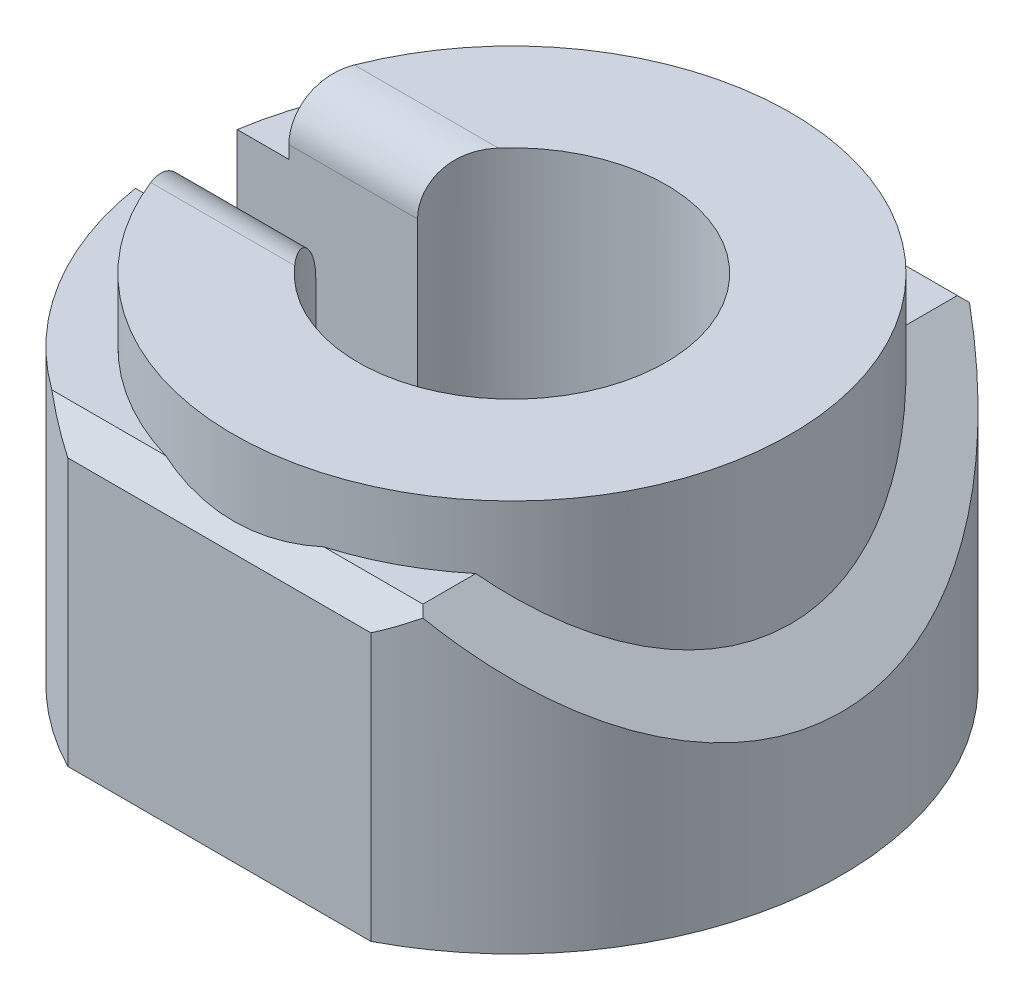
ISO-10303-21;
HEADER;
FILE_DESCRIPTION(('STEP AP214'),'2;1');
FILE_NAME('part.step','',(''),(''),'','','');
FILE_SCHEMA(('AUTOMOTIVE_DESIGN { 1 0 10303 214 1 1 1 1 }'));
ENDSEC;
DATA;
#1=APPLICATION_CONTEXT('core data for automotive mechanical design processes');
#2=APPLICATION_PROTOCOL_DEFINITION('international standard','automotive_design',2000,#1);
#3=PRODUCT_CONTEXT('',#1,'mechanical');
#4=PRODUCT('Part','Part','',(#3));
#5=PRODUCT_RELATED_PRODUCT_CATEGORY('part','',(#4));
#6=PRODUCT_DEFINITION_FORMATION('','',#4);
#7=PRODUCT_DEFINITION_CONTEXT('part definition',#1,'design');
#8=PRODUCT_DEFINITION('design','',#6,#7);
#9=PRODUCT_DEFINITION_SHAPE('','',#8);
#10=(LENGTH_UNIT() NAMED_UNIT(*) SI_UNIT(.MILLI.,.METRE.));
#11=(NAMED_UNIT(*) PLANE_ANGLE_UNIT() SI_UNIT($,.RADIAN.));
#12=(NAMED_UNIT(*) SI_UNIT($,.STERADIAN.) SOLID_ANGLE_UNIT());
#13=UNCERTAINTY_MEASURE_WITH_UNIT(LENGTH_MEASURE(1.E-05),#10,'distance_accuracy_value','');
#14=(GEOMETRIC_REPRESENTATION_CONTEXT(3) GLOBAL_UNCERTAINTY_ASSIGNED_CONTEXT((#13)) GLOBAL_UNIT_ASSIGNED_CONTEXT((#10,
#11,#12)) REPRESENTATION_CONTEXT('',''));
#15=CARTESIAN_POINT('',(0.,0.,0.));
#16=DIRECTION('',(0.,0.,1.));
#17=DIRECTION('',(1.,0.,0.));
#18=AXIS2_PLACEMENT_3D('',#15,#16,#17);
#19=CARTESIAN_POINT('',(0.,9.5,0.));
#20=DIRECTION('',(0.,1.,0.));
#21=DIRECTION('',(0.,0.,1.));
#22=AXIS2_PLACEMENT_3D('',#19,#20,#21);
#23=PLANE('',#22);
#24=DIRECTION('',(0.,0.,1.));
#25=VECTOR('',#24,1.);
#26=CARTESIAN_POINT('',(7.,9.5,0.));
#27=LINE('',#26,#25);
#28=CARTESIAN_POINT('',(7.,9.5,-10.5));
#29=VERTEX_POINT('',#28);
#30=CARTESIAN_POINT('',(7.,9.5,-8.42036222498771));
#31=VERTEX_POINT('',#30);
#32=EDGE_CURVE('E518',#29,#31,#27,.T.);
#33=ORIENTED_EDGE('',*,*,#32,.F.);
#34=DIRECTION('',(-1.,0.,0.));
#35=VECTOR('',#34,1.);
#36=CARTESIAN_POINT('',(-5.95420019817944,9.5,-10.5));
#37=LINE('',#36,#35);
#38=CARTESIAN_POINT('',(3.10684727658123,9.5,-10.5));
#39=VERTEX_POINT('',#38);
#40=EDGE_CURVE('E118',#29,#39,#37,.T.);
#41=ORIENTED_EDGE('',*,*,#40,.T.);
#42=CARTESIAN_POINT('',(0.,9.5,0.));
#43=DIRECTION('',(0.,1.,0.));
#44=DIRECTION('',(0.,0.,1.));
#45=AXIS2_PLACEMENT_3D('',#42,#43,#44);
#46=CIRCLE('',#45,10.95);
#47=EDGE_CURVE('E257',#39,#31,#46,.F.);
#48=ORIENTED_EDGE('',*,*,#47,.T.);
#49=EDGE_LOOP('',(#33,#41,#48));
#50=FACE_BOUND('',#49,.T.);
#51=ADVANCED_FACE('F103',(#50),#23,.T.);
#52=CARTESIAN_POINT('',(0.,9.5,0.));
#53=DIRECTION('',(0.,1.,0.));
#54=DIRECTION('',(0.,0.,1.));
#55=AXIS2_PLACEMENT_3D('',#52,#53,#54);
#56=CIRCLE('',#55,12.95);
#57=CARTESIAN_POINT('',(-12.7946277788766,9.5,2.));
#58=VERTEX_POINT('',#57);
#59=CARTESIAN_POINT('',(-7.57974273969772,9.5,10.5));
#60=VERTEX_POINT('',#59);
#61=EDGE_CURVE('E457',#58,#60,#56,.T.);
#62=ORIENTED_EDGE('',*,*,#61,.T.);
#63=DIRECTION('',(1.,0.,0.));
#64=VECTOR('',#63,1.);
#65=CARTESIAN_POINT('',(0.,9.5,10.5));
#66=LINE('',#65,#64);
#67=CARTESIAN_POINT('',(-3.10684727658125,9.5,10.5));
#68=VERTEX_POINT('',#67);
#69=EDGE_CURVE('E450',#60,#68,#66,.T.);
#70=ORIENTED_EDGE('',*,*,#69,.T.);
#71=CARTESIAN_POINT('',(-10.7658023388877,9.5,2.));
#72=VERTEX_POINT('',#71);
#73=EDGE_CURVE('E256',#68,#72,#46,.F.);
#74=ORIENTED_EDGE('',*,*,#73,.T.);
#75=DIRECTION('',(1.,0.,0.));
#76=VECTOR('',#75,1.);
#77=CARTESIAN_POINT('',(0.,9.5,2.));
#78=LINE('',#77,#76);
#79=EDGE_CURVE('E514',#58,#72,#78,.T.);
#80=ORIENTED_EDGE('',*,*,#79,.F.);
#81=EDGE_LOOP('',(#62,#70,#74,#80));
#82=FACE_BOUND('',#81,.T.);
#83=ADVANCED_FACE('F382',(#82),#23,.T.);
#84=CARTESIAN_POINT('',(-10.7658023388877,9.5,-2.));
#85=VERTEX_POINT('',#84);
#86=CARTESIAN_POINT('',(-3.10684727658123,9.5,-10.5));
#87=VERTEX_POINT('',#86);
#88=EDGE_CURVE('E247',#85,#87,#46,.F.);
#89=ORIENTED_EDGE('',*,*,#88,.T.);
#90=DIRECTION('',(-1.,0.,0.));
#91=VECTOR('',#90,1.);
#92=CARTESIAN_POINT('',(-5.95420019817944,9.5,-10.5));
#93=LINE('',#92,#91);
#94=CARTESIAN_POINT('',(-7.57974273969771,9.5,-10.5));
#95=VERTEX_POINT('',#94);
#96=EDGE_CURVE('E439',#87,#95,#93,.T.);
#97=ORIENTED_EDGE('',*,*,#96,.T.);
#98=CARTESIAN_POINT('',(-12.7946277788766,9.5,-2.));
#99=VERTEX_POINT('',#98);
#100=EDGE_CURVE('E250',#95,#99,#56,.T.);
#101=ORIENTED_EDGE('',*,*,#100,.T.);
#102=DIRECTION('',(1.,0.,0.));
#103=VECTOR('',#102,1.);
#104=CARTESIAN_POINT('',(0.,9.5,-2.));
#105=LINE('',#104,#103);
#106=EDGE_CURVE('E240',#99,#85,#105,.T.);
#107=ORIENTED_EDGE('',*,*,#106,.T.);
#108=EDGE_LOOP('',(#89,#97,#101,#107));
#109=FACE_BOUND('',#108,.T.);
#110=ADVANCED_FACE('F246',(#109),#23,.T.);
#111=CARTESIAN_POINT('',(8.25,8.25,-11.5));
#112=DIRECTION('',(-0.707106781186548,-0.707106781186548,0.));
#113=DIRECTION('',(0.707106781186548,-0.707106781186548,0.));
#114=AXIS2_PLACEMENT_3D('',#111,#112,#113);
#115=PLANE('',#114);
#116=CARTESIAN_POINT('',(7.,9.5,8.42036222498771));
#117=VERTEX_POINT('',#116);
#118=CARTESIAN_POINT('',(7.,9.5,10.5));
#119=VERTEX_POINT('',#118);
#120=EDGE_CURVE('E433',#117,#119,#27,.T.);
#121=ORIENTED_EDGE('',*,*,#120,.T.);
#122=DIRECTION('',(-0.577350269189624,0.577350269189624,-0.57735026918963));
#123=VECTOR('',#122,1.);
#124=CARTESIAN_POINT('',(4.66666666666668,11.8333333333333,8.16666666666664));
#125=LINE('',#124,#123);
#126=CARTESIAN_POINT('',(7.23825622687739,9.26174377312261,10.7382562268774));
#127=VERTEX_POINT('',#126);
#128=EDGE_CURVE('E460',#119,#127,#125,.F.);
#129=ORIENTED_EDGE('',*,*,#128,.T.);
#130=CARTESIAN_POINT('',(0.,16.5,0.));
#131=DIRECTION('',(-0.707106781186548,-0.707106781186548,0.));
#132=DIRECTION('',(-0.707106781186548,0.707106781186548,0.));
#133=AXIS2_PLACEMENT_3D('',#130,#131,#132);
#134=ELLIPSE('',#133,18.3140656327316,12.95);
#135=CARTESIAN_POINT('',(7.23825622687738,9.26174377312261,-10.7382562268774));
#136=VERTEX_POINT('',#135);
#137=EDGE_CURVE('E521',#127,#136,#134,.F.);
#138=ORIENTED_EDGE('',*,*,#137,.T.);
#139=DIRECTION('',(-0.577350269189628,0.577350269189628,0.577350269189622));
#140=VECTOR('',#139,1.);
#141=CARTESIAN_POINT('',(5.33333333333333,11.1666666666667,-8.83333333333333));
#142=LINE('',#141,#140);
#143=EDGE_CURVE('E458',#136,#29,#142,.T.);
#144=ORIENTED_EDGE('',*,*,#143,.T.);
#145=ORIENTED_EDGE('',*,*,#32,.T.);
#146=CARTESIAN_POINT('',(0.,16.5,0.));
#147=DIRECTION('',(-0.707106781186548,-0.707106781186548,0.));
#148=DIRECTION('',(0.707106781186548,-0.707106781186548,0.));
#149=AXIS2_PLACEMENT_3D('',#146,#147,#148);
#150=ELLIPSE('',#149,15.4856385079854,10.95);
#151=EDGE_CURVE('E276',#117,#31,#150,.F.);
#152=ORIENTED_EDGE('',*,*,#151,.F.);
#153=EDGE_LOOP('',(#121,#129,#138,#144,#145,#152));
#154=FACE_BOUND('',#153,.T.);
#155=ADVANCED_FACE('F399',(#154),#115,.F.);
#156=CARTESIAN_POINT('',(0.,-38.6281312654632,0.));
#157=DIRECTION('',(0.,1.,0.));
#158=DIRECTION('',(0.,0.,1.));
#159=AXIS2_PLACEMENT_3D('',#156,#157,#158);
#160=CYLINDRICAL_SURFACE('',#159,12.95);
#161=ORIENTED_EDGE('',*,*,#137,.F.);
#162=CARTESIAN_POINT('',(0.,19.9999999999999,0.));
#163=DIRECTION('',(0.,-0.707106781186551,-0.707106781186544));
#164=DIRECTION('',(0.,0.707106781186544,-0.707106781186551));
#165=AXIS2_PLACEMENT_3D('',#162,#163,#164);
#166=ELLIPSE('',#165,18.3140656327315,12.95);
#167=CARTESIAN_POINT('',(5.95420019817943,8.49999999999999,11.5));
#168=VERTEX_POINT('',#167);
#169=EDGE_CURVE('E467',#127,#168,#166,.T.);
#170=ORIENTED_EDGE('',*,*,#169,.T.);
#171=DIRECTION('',(0.,1.,0.));
#172=VECTOR('',#171,1.);
#173=CARTESIAN_POINT('',(5.95420019817943,-38.6281312654632,11.5));
#174=LINE('',#173,#172);
#175=CARTESIAN_POINT('',(5.95420019817943,-2.,11.5));
#176=VERTEX_POINT('',#175);
#177=EDGE_CURVE('E475',#168,#176,#174,.F.);
#178=ORIENTED_EDGE('',*,*,#177,.T.);
#179=CARTESIAN_POINT('',(0.,-2.,0.));
#180=DIRECTION('',(0.,1.,0.));
#181=DIRECTION('',(0.,0.,1.));
#182=AXIS2_PLACEMENT_3D('',#179,#180,#181);
#183=CIRCLE('',#182,12.95);
#184=CARTESIAN_POINT('',(5.95420019817944,-2.,-11.5));
#185=VERTEX_POINT('',#184);
#186=EDGE_CURVE('E471',#185,#176,#183,.F.);
#187=ORIENTED_EDGE('',*,*,#186,.F.);
#188=DIRECTION('',(0.,1.,0.));
#189=VECTOR('',#188,1.);
#190=CARTESIAN_POINT('',(5.95420019817944,-38.6281312654632,-11.5));
#191=LINE('',#190,#189);
#192=CARTESIAN_POINT('',(5.95420019817944,8.49999999999998,-11.5));
#193=VERTEX_POINT('',#192);
#194=EDGE_CURVE('E432',#193,#185,#191,.F.);
#195=ORIENTED_EDGE('',*,*,#194,.F.);
#196=CARTESIAN_POINT('',(0.,20.0000000000001,0.));
#197=DIRECTION('',(0.,0.707106781186544,-0.707106781186551));
#198=DIRECTION('',(0.,0.707106781186551,0.707106781186544));
#199=AXIS2_PLACEMENT_3D('',#196,#197,#198);
#200=ELLIPSE('',#199,18.3140656327317,12.95);
#201=EDGE_CURVE('E438',#193,#136,#200,.F.);
#202=ORIENTED_EDGE('',*,*,#201,.T.);
#203=EDGE_LOOP('',(#161,#170,#178,#187,#195,#202));
#204=FACE_BOUND('',#203,.T.);
#205=ADVANCED_FACE('F335',(#204),#160,.T.);
#206=DIRECTION('',(0.,1.,0.));
#207=VECTOR('',#206,1.);
#208=CARTESIAN_POINT('',(-5.95420019817943,-38.6281312654632,11.5));
#209=LINE('',#208,#207);
#210=CARTESIAN_POINT('',(-5.95420019817943,-2.,11.5));
#211=VERTEX_POINT('',#210);
#212=CARTESIAN_POINT('',(-5.95420019817943,8.49999999999999,11.5));
#213=VERTEX_POINT('',#212);
#214=EDGE_CURVE('E525',#211,#213,#209,.T.);
#215=ORIENTED_EDGE('',*,*,#214,.T.);
#216=CARTESIAN_POINT('',(0.,19.9999999999999,0.));
#217=DIRECTION('',(0.,-0.707106781186551,-0.707106781186544));
#218=DIRECTION('',(0.,0.707106781186544,-0.707106781186551));
#219=AXIS2_PLACEMENT_3D('',#216,#217,#218);
#220=ELLIPSE('',#219,18.3140656327315,12.95);
#221=EDGE_CURVE('E440',#213,#60,#220,.T.);
#222=ORIENTED_EDGE('',*,*,#221,.T.);
#223=ORIENTED_EDGE('',*,*,#61,.F.);
#224=DIRECTION('',(0.,1.,0.));
#225=VECTOR('',#224,1.);
#226=CARTESIAN_POINT('',(-12.7946277788766,-38.6281312654632,2.));
#227=LINE('',#226,#225);
#228=CARTESIAN_POINT('',(-12.7946277788766,2.,2.));
#229=VERTEX_POINT('',#228);
#230=EDGE_CURVE('E516',#229,#58,#227,.T.);
#231=ORIENTED_EDGE('',*,*,#230,.F.);
#232=CARTESIAN_POINT('',(-12.7946277788766,2.,2.));
#233=CARTESIAN_POINT('',(-12.7946256332506,1.94408781043635,2.00000002573826));
#234=CARTESIAN_POINT('',(-12.7949947479576,1.88820273819576,1.99765388963397));
#235=CARTESIAN_POINT('',(-12.7964529824156,1.77683916091667,1.98829682131698));
#236=CARTESIAN_POINT('',(-12.7975420354279,1.72136061867447,1.98128632149406));
#237=CARTESIAN_POINT('',(-12.8018492907163,1.55628329415424,1.95333880678219));
#238=CARTESIAN_POINT('',(-12.8061077787187,1.44780072599633,1.92548550077359));
#239=CARTESIAN_POINT('',(-12.8169175381375,1.23712269491746,1.85215577418208));
#240=CARTESIAN_POINT('',(-12.8234694310701,1.13492894511174,1.80667457605526));
#241=CARTESIAN_POINT('',(-12.8381248342533,0.939604815726317,1.69940297039855));
#242=CARTESIAN_POINT('',(-12.8462283567749,0.846474507833138,1.63761243388568));
#243=CARTESIAN_POINT('',(-12.8631491660451,0.67116909493783,1.49893143639688));
#244=CARTESIAN_POINT('',(-12.8719713191882,0.589080746372092,1.42193194358738));
#245=CARTESIAN_POINT('',(-12.8892934354307,0.438922995521076,1.25523787570596));
#246=CARTESIAN_POINT('',(-12.8977933369221,0.37085626297225,1.16554088848749));
#247=CARTESIAN_POINT('',(-12.9135655225394,0.250350104548857,0.975429449628954));
#248=CARTESIAN_POINT('',(-12.9208310146627,0.197995996840185,0.874960367828575));
#249=CARTESIAN_POINT('',(-12.9332549284202,0.110966222855452,0.666545430716961));
#250=CARTESIAN_POINT('',(-12.9384147257827,0.0762790104560916,0.558604511132324));
#251=CARTESIAN_POINT('',(-12.9447779408629,0.0340254317766947,0.375025780588701));
#252=CARTESIAN_POINT('',(-12.9467261965863,0.0212778955814986,0.300564992169304));
#253=CARTESIAN_POINT('',(-12.9493413997215,0.00426401957549387,0.150747445660465));
#254=CARTESIAN_POINT('',(-12.9500098440486,-1.22287739625539E-05,0.0753918381634177));
#255=CARTESIAN_POINT('',(-12.95,0.,0.));
#256=B_SPLINE_CURVE_WITH_KNOTS('',3,(#232,#233,#234,#235,#236,#237,#238,#239,#240,#241,#242,
#243,#244,#245,#246,#247,#248,#249,#250,#251,#252,#253,#254,#255),.UNSPECIFIED.,.F.,.F.,(4,2,2,
2,2,2,2,2,2,2,2,4),(0.,0.167632475682958,0.335249413883563,0.669766357677263,1.00437402633827,
1.33898434133517,1.67608672267633,2.01325322960552,2.35221870858211,2.69096237295107,
2.91720895132186,3.14319074117967),.UNSPECIFIED.);
#257=CARTESIAN_POINT('',(-12.95,0.,0.));
#258=VERTEX_POINT('',#257);
#259=EDGE_CURVE('E351',#229,#258,#256,.T.);
#260=ORIENTED_EDGE('',*,*,#259,.T.);
#261=CARTESIAN_POINT('',(-12.95,0.,0.));
#262=CARTESIAN_POINT('',(-12.950002014148,-1.48172827576487E-08,-0.0559162229000142));
#263=CARTESIAN_POINT('',(-12.9496373883563,0.00234644960810226,-0.111805341523206));
#264=CARTESIAN_POINT('',(-12.9481962405879,0.0117048966110774,-0.223177238487953));
#265=CARTESIAN_POINT('',(-12.9471197832777,0.0187164553872645,-0.278660053277413));
#266=CARTESIAN_POINT('',(-12.942860681548,0.0466685575209166,-0.443751704701726));
#267=CARTESIAN_POINT('',(-12.9386481279771,0.074526800289537,-0.55224462048176));
#268=CARTESIAN_POINT('',(-12.9279380237389,0.147870899920632,-0.762943912039565));
#269=CARTESIAN_POINT('',(-12.9214398346178,0.193361682499116,-0.865148521902833));
#270=CARTESIAN_POINT('',(-12.9068762993701,0.300655680759331,-1.06049052813423));
#271=CARTESIAN_POINT('',(-12.8988109492736,0.362458937763857,-1.15362790153239));
#272=CARTESIAN_POINT('',(-12.8819363508063,0.501152788024086,-1.32892507689081));
#273=CARTESIAN_POINT('',(-12.8731221313219,0.578149556362757,-1.41100036080273));
#274=CARTESIAN_POINT('',(-12.8557803600952,0.744832811767629,-1.56113298045433));
#275=CARTESIAN_POINT('',(-12.8472528645212,0.834521767473071,-1.62918758282288));
#276=CARTESIAN_POINT('',(-12.8314006752412,1.02462611917453,-1.7496809627547));
#277=CARTESIAN_POINT('',(-12.824082821451,1.12509754611792,-1.80203221684575));
#278=CARTESIAN_POINT('',(-12.8115538637689,1.33351726637838,-1.88905593253119));
#279=CARTESIAN_POINT('',(-12.8063413737306,1.44146058526554,-1.92374002991201));
#280=CARTESIAN_POINT('',(-12.7999100470753,1.62503072282316,-1.96598485794204));
#281=CARTESIAN_POINT('',(-12.7979397392583,1.69947979903887,-1.97872844716275));
#282=CARTESIAN_POINT('',(-12.7952941861159,1.84927457081914,-1.99573722333451));
#283=CARTESIAN_POINT('',(-12.7946174381016,1.92461912358411,-2.0000122481689));
#284=CARTESIAN_POINT('',(-12.7946277788766,2.,-2.));
#285=B_SPLINE_CURVE_WITH_KNOTS('',3,(#261,#262,#263,#264,#265,#266,#267,#268,#269,#270,#271,
#272,#273,#274,#275,#276,#277,#278,#279,#280,#281,#282,#283,#284),.UNSPECIFIED.,.F.,.F.,(4,2,2,
2,2,2,2,2,2,2,2,4),(0.,0.167644611880985,0.335273996133688,0.669819430009937,1.00445838783946,
1.33909819338527,1.67616509087818,2.01329763845469,2.35227571580648,2.69103024881158,
2.91724192675227,3.14319066139638),.UNSPECIFIED.);
#286=CARTESIAN_POINT('',(-12.7946277788766,2.,-2.));
#287=VERTEX_POINT('',#286);
#288=EDGE_CURVE('E352',#258,#287,#285,.T.);
#289=ORIENTED_EDGE('',*,*,#288,.T.);
#290=DIRECTION('',(0.,1.,0.));
#291=VECTOR('',#290,1.);
#292=CARTESIAN_POINT('',(-12.7946277788766,-38.6281312654632,-2.));
#293=LINE('',#292,#291);
#294=EDGE_CURVE('E252',#287,#99,#293,.T.);
#295=ORIENTED_EDGE('',*,*,#294,.T.);
#296=ORIENTED_EDGE('',*,*,#100,.F.);
#297=CARTESIAN_POINT('',(0.,20.0000000000001,0.));
#298=DIRECTION('',(0.,0.707106781186544,-0.707106781186551));
#299=DIRECTION('',(0.,0.707106781186551,0.707106781186544));
#300=AXIS2_PLACEMENT_3D('',#297,#298,#299);
#301=ELLIPSE('',#300,18.3140656327317,12.95);
#302=CARTESIAN_POINT('',(-5.95420019817944,8.49999999999998,-11.5));
#303=VERTEX_POINT('',#302);
#304=EDGE_CURVE('E436',#95,#303,#301,.F.);
#305=ORIENTED_EDGE('',*,*,#304,.T.);
#306=DIRECTION('',(0.,1.,0.));
#307=VECTOR('',#306,1.);
#308=CARTESIAN_POINT('',(-5.95420019817944,-38.6281312654632,-11.5));
#309=LINE('',#308,#307);
#310=CARTESIAN_POINT('',(-5.95420019817944,-2.,-11.5));
#311=VERTEX_POINT('',#310);
#312=EDGE_CURVE('E427',#311,#303,#309,.T.);
#313=ORIENTED_EDGE('',*,*,#312,.F.);
#314=EDGE_CURVE('E473',#211,#311,#183,.F.);
#315=ORIENTED_EDGE('',*,*,#314,.F.);
#316=EDGE_LOOP('',(#215,#222,#223,#231,#260,#289,#295,#296,#305,#313,#315));
#317=FACE_BOUND('',#316,.T.);
#318=ADVANCED_FACE('F391',(#317),#160,.T.);
#319=CARTESIAN_POINT('',(3.10684727658125,9.5,10.5));
#320=VERTEX_POINT('',#319);
#321=EDGE_CURVE('E259',#117,#320,#46,.F.);
#322=ORIENTED_EDGE('',*,*,#321,.T.);
#323=DIRECTION('',(1.,0.,0.));
#324=VECTOR('',#323,1.);
#325=CARTESIAN_POINT('',(0.,9.5,10.5));
#326=LINE('',#325,#324);
#327=EDGE_CURVE('E452',#320,#119,#326,.T.);
#328=ORIENTED_EDGE('',*,*,#327,.T.);
#329=ORIENTED_EDGE('',*,*,#120,.F.);
#330=EDGE_LOOP('',(#322,#328,#329));
#331=FACE_BOUND('',#330,.T.);
#332=ADVANCED_FACE('F383',(#331),#23,.T.);
#333=CARTESIAN_POINT('',(0.,-2.,0.));
#334=DIRECTION('',(0.,1.,0.));
#335=DIRECTION('',(0.,0.,1.));
#336=AXIS2_PLACEMENT_3D('',#333,#334,#335);
#337=PLANE('',#336);
#338=CARTESIAN_POINT('',(0.,-2.,0.));
#339=DIRECTION('',(0.,1.,0.));
#340=DIRECTION('',(0.,0.,1.));
#341=AXIS2_PLACEMENT_3D('',#338,#339,#340);
#342=CIRCLE('',#341,1.6);
#343=CARTESIAN_POINT('',(0.,-2.,1.6));
#344=VERTEX_POINT('',#343);
#345=EDGE_CURVE('E502',#344,#344,#342,.T.);
#346=ORIENTED_EDGE('',*,*,#345,.T.);
#347=EDGE_LOOP('',(#346));
#348=FACE_BOUND('',#347,.T.);
#349=DIRECTION('',(1.,0.,0.));
#350=VECTOR('',#349,1.);
#351=CARTESIAN_POINT('',(0.,-2.,11.5));
#352=LINE('',#351,#350);
#353=EDGE_CURVE('E270',#211,#176,#352,.T.);
#354=ORIENTED_EDGE('',*,*,#353,.F.);
#355=ORIENTED_EDGE('',*,*,#314,.T.);
#356=DIRECTION('',(1.,0.,0.));
#357=VECTOR('',#356,1.);
#358=CARTESIAN_POINT('',(0.,-2.,-11.5));
#359=LINE('',#358,#357);
#360=EDGE_CURVE('E264',#311,#185,#359,.T.);
#361=ORIENTED_EDGE('',*,*,#360,.T.);
#362=ORIENTED_EDGE('',*,*,#186,.T.);
#363=EDGE_LOOP('',(#354,#355,#361,#362));
#364=FACE_BOUND('',#363,.T.);
#365=ADVANCED_FACE('F390',(#348,#364),#337,.F.);
#366=CARTESIAN_POINT('',(0.,-2.,0.));
#367=DIRECTION('',(0.,1.,0.));
#368=DIRECTION('',(0.,0.,1.));
#369=AXIS2_PLACEMENT_3D('',#366,#367,#368);
#370=CYLINDRICAL_SURFACE('',#369,10.95);
#371=CARTESIAN_POINT('',(0.,12.,0.));
#372=DIRECTION('',(0.,1.,0.));
#373=DIRECTION('',(0.,0.,1.));
#374=AXIS2_PLACEMENT_3D('',#371,#372,#373);
#375=CIRCLE('',#374,10.95);
#376=CARTESIAN_POINT('',(-10.1932575754761,12.,4.));
#377=VERTEX_POINT('',#376);
#378=CARTESIAN_POINT('',(-10.1932575754761,12.,-4.));
#379=VERTEX_POINT('',#378);
#380=EDGE_CURVE('E481',#377,#379,#375,.T.);
#381=ORIENTED_EDGE('',*,*,#380,.F.);
#382=CARTESIAN_POINT('',(-10.1932575754761,12.,4.));
#383=CARTESIAN_POINT('',(-10.215252763081,11.9999980404342,3.94395580736491));
#384=CARTESIAN_POINT('',(-10.2367726894939,11.9976424240735,3.88774865686013));
#385=CARTESIAN_POINT('',(-10.278763936511,11.9881427232847,3.77532885443158));
#386=CARTESIAN_POINT('',(-10.2992349308407,11.9809971585409,3.7191162061801));
#387=CARTESIAN_POINT('',(-10.3589318186561,11.9522440665045,3.55093412099844));
#388=CARTESIAN_POINT('',(-10.396414218504,11.9233199415595,3.43949052860539));
#389=CARTESIAN_POINT('',(-10.4660062849451,11.8459210445999,3.22154624898223));
#390=CARTESIAN_POINT('',(-10.4981034747342,11.7974017349488,3.11505744249417));
#391=CARTESIAN_POINT('',(-10.5564731190204,11.6816816580941,2.91111916175955));
#392=CARTESIAN_POINT('',(-10.5827523464388,11.6145028208865,2.81365925433323));
#393=CARTESIAN_POINT('',(-10.6284541461997,11.4667138672042,2.6356283805551));
#394=CARTESIAN_POINT('',(-10.648139927659,11.386878914054,2.55448069235084));
#395=CARTESIAN_POINT('',(-10.6825646937403,11.2139256856405,2.40647086598696));
#396=CARTESIAN_POINT('',(-10.6973022679429,11.1208036338297,2.33961280286125));
#397=CARTESIAN_POINT('',(-10.721848488476,10.9270807844682,2.22437484910673));
#398=CARTESIAN_POINT('',(-10.7317936886813,10.8267944908461,2.17549381476017));
#399=CARTESIAN_POINT('',(-10.7477910021851,10.6192576023916,2.09503794195539));
#400=CARTESIAN_POINT('',(-10.7538463120501,10.5120128058043,2.06344889675159));
#401=CARTESIAN_POINT('',(-10.7606900674744,10.3366406188279,2.02737163758506));
#402=CARTESIAN_POINT('',(-10.7626129789312,10.269688414526,2.01711247846942));
#403=CARTESIAN_POINT('',(-10.7651655394167,10.1351674568692,2.00342879892052));
#404=CARTESIAN_POINT('',(-10.7657971441038,10.0675997917526,1.99999394343758));
#405=CARTESIAN_POINT('',(-10.7658023388877,10.,2.));
#406=B_SPLINE_CURVE_WITH_KNOTS('',3,(#382,#383,#384,#385,#386,#387,#388,#389,#390,#391,#392,
#393,#394,#395,#396,#397,#398,#399,#400,#401,#402,#403,#404,#405),.UNSPECIFIED.,.F.,.F.,(4,2,2,
2,2,2,2,2,2,2,2,4),(0.,0.180521425972547,0.36109866715912,0.722475887843784,1.08467914258227,
1.44645849863325,1.79131682507501,2.1362733654185,2.47071461982338,2.80488069013857,
3.00783442325068,3.21048055858087),.UNSPECIFIED.);
#407=CARTESIAN_POINT('',(-10.7658023388877,10.,2.));
#408=VERTEX_POINT('',#407);
#409=EDGE_CURVE('E293',#377,#408,#406,.T.);
#410=ORIENTED_EDGE('',*,*,#409,.T.);
#411=DIRECTION('',(0.,1.,0.));
#412=VECTOR('',#411,1.);
#413=CARTESIAN_POINT('',(-10.7658023388877,-2.,2.));
#414=LINE('',#413,#412);
#415=EDGE_CURVE('E511',#72,#408,#414,.T.);
#416=ORIENTED_EDGE('',*,*,#415,.F.);
#417=ORIENTED_EDGE('',*,*,#73,.F.);
#418=CARTESIAN_POINT('',(0.,19.9999999999999,0.));
#419=DIRECTION('',(0.,-0.707106781186551,-0.707106781186544));
#420=DIRECTION('',(0.,0.707106781186544,-0.707106781186551));
#421=AXIS2_PLACEMENT_3D('',#418,#419,#420);
#422=ELLIPSE('',#421,15.4856385079853,10.95);
#423=EDGE_CURVE('E111',#68,#320,#422,.F.);
#424=ORIENTED_EDGE('',*,*,#423,.T.);
#425=ORIENTED_EDGE('',*,*,#321,.F.);
#426=ORIENTED_EDGE('',*,*,#151,.T.);
#427=ORIENTED_EDGE('',*,*,#47,.F.);
#428=CARTESIAN_POINT('',(0.,20.0000000000001,0.));
#429=DIRECTION('',(0.,0.707106781186544,-0.707106781186551));
#430=DIRECTION('',(0.,0.707106781186551,0.707106781186544));
#431=AXIS2_PLACEMENT_3D('',#428,#429,#430);
#432=ELLIPSE('',#431,15.4856385079855,10.95);
#433=EDGE_CURVE('E12',#39,#87,#432,.T.);
#434=ORIENTED_EDGE('',*,*,#433,.T.);
#435=ORIENTED_EDGE('',*,*,#88,.F.);
#436=DIRECTION('',(0.,1.,0.));
#437=VECTOR('',#436,1.);
#438=CARTESIAN_POINT('',(-10.7658023388877,-2.,-2.));
#439=LINE('',#438,#437);
#440=CARTESIAN_POINT('',(-10.7658023388877,10.,-2.));
#441=VERTEX_POINT('',#440);
#442=EDGE_CURVE('E235',#85,#441,#439,.T.);
#443=ORIENTED_EDGE('',*,*,#442,.T.);
#444=CARTESIAN_POINT('',(-10.7658023388877,10.,-2.));
#445=CARTESIAN_POINT('',(-10.7657998873099,10.0553582028588,-1.99999993684639));
#446=CARTESIAN_POINT('',(-10.7653753538818,10.1106898730469,-2.00229990746368));
#447=CARTESIAN_POINT('',(-10.7636662232265,10.2209566549138,-2.01147247984258));
#448=CARTESIAN_POINT('',(-10.7623816690621,10.2758917863087,-2.01834485265639));
#449=CARTESIAN_POINT('',(-10.757220221801,10.4394004844256,-2.04574708555658));
#450=CARTESIAN_POINT('',(-10.7520356433773,10.5468776363525,-2.0730622841861));
#451=CARTESIAN_POINT('',(-10.7379249867092,10.7556341988424,-2.14494578853034));
#452=CARTESIAN_POINT('',(-10.7289971088818,10.8569106015351,-2.18952239183904));
#453=CARTESIAN_POINT('',(-10.7070375952912,11.0504094007113,-2.29449546774585));
#454=CARTESIAN_POINT('',(-10.6940065910536,11.1426331876494,-2.3548895055899));
#455=CARTESIAN_POINT('',(-10.663441302374,11.3156132570701,-2.48963518133261));
#456=CARTESIAN_POINT('',(-10.6459003049603,11.3963521640152,-2.56400758077179));
#457=CARTESIAN_POINT('',(-10.6060347247716,11.5440971934401,-2.72421116398895));
#458=CARTESIAN_POINT('',(-10.583710153558,11.6111033491097,-2.81004232007207));
#459=CARTESIAN_POINT('',(-10.5338703812319,11.7305650593691,-2.99149138482339));
#460=CARTESIAN_POINT('',(-10.5062953235317,11.7828336329972,-3.08721567446595));
#461=CARTESIAN_POINT('',(-10.4462675291435,11.8707994852415,-3.28460588133174));
#462=CARTESIAN_POINT('',(-10.4138128839891,11.9064902576427,-3.38627411375307));
#463=CARTESIAN_POINT('',(-10.3508352796189,11.9559582584554,-3.57359590414467));
#464=CARTESIAN_POINT('',(-10.3210475147448,11.972552033782,-3.65877150228198));
#465=CARTESIAN_POINT('',(-10.2589563222909,11.9945730418643,-3.82944868317047));
#466=CARTESIAN_POINT('',(-10.2266582993269,12.0000236106701,-3.91494920822444));
#467=CARTESIAN_POINT('',(-10.1932575754761,12.,-4.));
#468=B_SPLINE_CURVE_WITH_KNOTS('',3,(#444,#445,#446,#447,#448,#449,#450,#451,#452,#453,#454,
#455,#456,#457,#458,#459,#460,#461,#462,#463,#464,#465,#466,#467),.UNSPECIFIED.,.F.,.F.,(4,2,2,
2,2,2,2,2,2,2,2,4),(0.,0.165972516705542,0.331936723516194,0.663271950051158,0.994766648251569,
1.32621034992755,1.65815027952558,1.99008940686704,2.3260677397977,2.66217782144776,
2.93671832017174,3.21068328609285),.UNSPECIFIED.);
#469=EDGE_CURVE('E286',#441,#379,#468,.T.);
#470=ORIENTED_EDGE('',*,*,#469,.T.);
#471=EDGE_LOOP('',(#381,#410,#416,#417,#424,#425,#426,#427,#434,#435,#443,#470));
#472=FACE_BOUND('',#471,.T.);
#473=ADVANCED_FACE('F255',(#472),#370,.T.);
#474=CARTESIAN_POINT('',(0.,12.,0.));
#475=DIRECTION('',(0.,1.,0.));
#476=DIRECTION('',(0.,0.,1.));
#477=AXIS2_PLACEMENT_3D('',#474,#475,#476);
#478=PLANE('',#477);
#479=CARTESIAN_POINT('',(0.,12.,0.));
#480=DIRECTION('',(0.,1.,0.));
#481=DIRECTION('',(0.,0.,1.));
#482=AXIS2_PLACEMENT_3D('',#479,#480,#481);
#483=CIRCLE('',#482,6.05);
#484=CARTESIAN_POINT('',(-4.53899768671454,12.,4.));
#485=VERTEX_POINT('',#484);
#486=CARTESIAN_POINT('',(-4.53899768671455,12.,-4.));
#487=VERTEX_POINT('',#486);
#488=EDGE_CURVE('E478',#485,#487,#483,.T.);
#489=ORIENTED_EDGE('',*,*,#488,.F.);
#490=DIRECTION('',(-1.,0.,0.));
#491=VECTOR('',#490,1.);
#492=CARTESIAN_POINT('',(-10.7658023388877,12.,4.));
#493=LINE('',#492,#491);
#494=EDGE_CURVE('E283',#485,#377,#493,.T.);
#495=ORIENTED_EDGE('',*,*,#494,.T.);
#496=ORIENTED_EDGE('',*,*,#380,.T.);
#497=DIRECTION('',(-1.,0.,0.));
#498=VECTOR('',#497,1.);
#499=CARTESIAN_POINT('',(0.,12.,-4.));
#500=LINE('',#499,#498);
#501=EDGE_CURVE('E281',#379,#487,#500,.F.);
#502=ORIENTED_EDGE('',*,*,#501,.T.);
#503=EDGE_LOOP('',(#489,#495,#496,#502));
#504=FACE_BOUND('',#503,.T.);
#505=ADVANCED_FACE('F333',(#504),#478,.T.);
#506=CARTESIAN_POINT('',(0.,12.,0.));
#507=DIRECTION('',(0.,-1.,0.));
#508=DIRECTION('',(0.,0.,-1.));
#509=AXIS2_PLACEMENT_3D('',#506,#507,#508);
#510=CYLINDRICAL_SURFACE('',#509,6.05);
#511=DIRECTION('',(0.,-1.,0.));
#512=VECTOR('',#511,1.);
#513=CARTESIAN_POINT('',(-5.70985989320228,12.,2.));
#514=LINE('',#513,#512);
#515=CARTESIAN_POINT('',(-5.70985989320228,10.,2.));
#516=VERTEX_POINT('',#515);
#517=CARTESIAN_POINT('',(-5.70985989320228,2.,2.));
#518=VERTEX_POINT('',#517);
#519=EDGE_CURVE('E509',#516,#518,#514,.T.);
#520=ORIENTED_EDGE('',*,*,#519,.F.);
#521=CARTESIAN_POINT('',(-5.70985989320228,10.,2.));
#522=CARTESIAN_POINT('',(-5.70985665184003,10.0532053042563,1.99999336319484));
#523=CARTESIAN_POINT('',(-5.70911610995553,10.106408198698,2.00212303069396));
#524=CARTESIAN_POINT('',(-5.70613760373049,10.2124313776622,2.01060455256753));
#525=CARTESIAN_POINT('',(-5.7038997204515,10.2652516827405,2.01695617837775));
#526=CARTESIAN_POINT('',(-5.69790683103353,10.3700832199718,2.03382243456253));
#527=CARTESIAN_POINT('',(-5.69415340435184,10.422095236076,2.04433273065822));
#528=CARTESIAN_POINT('',(-5.68508985943883,10.5249797618576,2.0694031316168));
#529=CARTESIAN_POINT('',(-5.6797797620688,10.5758522867959,2.0839631822079));
#530=CARTESIAN_POINT('',(-5.66142560404254,10.7262712050896,2.13354689532509));
#531=CARTESIAN_POINT('',(-5.64595546194936,10.8236597079092,2.17448076487204));
#532=CARTESIAN_POINT('',(-5.60806890333301,11.0096716006424,2.27039669087423));
#533=CARTESIAN_POINT('',(-5.58565434606532,11.09829732828,2.32537498646975));
#534=CARTESIAN_POINT('',(-5.53329263570168,11.2649151662318,2.44736196058285));
#535=CARTESIAN_POINT('',(-5.50331588685253,11.3428635954746,2.51441760355374));
#536=CARTESIAN_POINT('',(-5.43561959081167,11.4860008954284,2.65759270433749));
#537=CARTESIAN_POINT('',(-5.39789887109547,11.551187830982,2.73371353398806));
#538=CARTESIAN_POINT('',(-5.31333235029421,11.6699608052301,2.8947440315096));
#539=CARTESIAN_POINT('',(-5.26621221211059,11.7230580441056,2.97986868169871));
#540=CARTESIAN_POINT('',(-5.16423745906089,11.814586533647,3.15329686891499));
#541=CARTESIAN_POINT('',(-5.10937859729739,11.8530096881788,3.24160213146669));
#542=CARTESIAN_POINT('',(-4.98660868172301,11.9192117565667,3.42781787679961));
#543=CARTESIAN_POINT('',(-4.91793216678617,11.9454518422045,3.52576450288015));
#544=CARTESIAN_POINT('',(-4.77342353859703,11.9826169982765,3.71906983601741));
#545=CARTESIAN_POINT('',(-4.69759553673488,11.9935508116895,3.81442998992018));
#546=CARTESIAN_POINT('',(-4.5925521730883,11.9993001488052,3.93861037214574));
#547=CARTESIAN_POINT('',(-4.56592474728217,12.0000006374235,3.96945085853243));
#548=CARTESIAN_POINT('',(-4.53899768671454,12.,4.));
#549=B_SPLINE_CURVE_WITH_KNOTS('',3,(#521,#522,#523,#524,#525,#526,#527,#528,#529,#530,#531,
#532,#533,#534,#535,#536,#537,#538,#539,#540,#541,#542,#543,#544,#545,#546,#547,#548),
.UNSPECIFIED.,.F.,.F.,(4,2,2,2,2,2,2,2,2,2,2,2,2,4),(0.,0.159563818875073,0.319119000144218,
0.478508324860532,0.637895513663203,0.956547369648708,1.27511398534209,1.59494724331591,
1.91482896341394,2.24596417783348,2.57728182648455,2.94334475203772,3.30919849615182,
3.43140717377676),.UNSPECIFIED.);
#550=EDGE_CURVE('E321',#516,#485,#549,.T.);
#551=ORIENTED_EDGE('',*,*,#550,.T.);
#552=ORIENTED_EDGE('',*,*,#488,.T.);
#553=CARTESIAN_POINT('',(-4.53899768671455,12.,-4.));
#554=CARTESIAN_POINT('',(-4.5952123473944,12.0000018733828,-3.93624044359645));
#555=CARTESIAN_POINT('',(-4.65009154089937,11.9969487981662,-3.87122741054082));
#556=CARTESIAN_POINT('',(-4.7568872906507,11.9840360777183,-3.73920943612675));
#557=CARTESIAN_POINT('',(-4.80879614295638,11.9741595309356,-3.67219994485277));
#558=CARTESIAN_POINT('',(-4.90928607823458,11.9468391869046,-3.53674437058339));
#559=CARTESIAN_POINT('',(-4.95785229014921,11.9293638236765,-3.46829344088454));
#560=CARTESIAN_POINT('',(-5.0509125213973,11.8862687103958,-3.33131147001513));
#561=CARTESIAN_POINT('',(-5.09541132393386,11.860658689466,-3.26278062148351));
#562=CARTESIAN_POINT('',(-5.19553953126565,11.7898137980772,-3.10174360738454));
#563=CARTESIAN_POINT('',(-5.249270406032,11.7408263874968,-3.00965658146611));
#564=CARTESIAN_POINT('',(-5.34755544814235,11.6264751161215,-2.83134348442092));
#565=CARTESIAN_POINT('',(-5.39213764589307,11.5611626797759,-2.74510007009821));
#566=CARTESIAN_POINT('',(-5.47224269093292,11.4144420933058,-2.58174141576826));
#567=CARTESIAN_POINT('',(-5.50772072186009,11.3329576925376,-2.50467229742834));
#568=CARTESIAN_POINT('',(-5.56956834027568,11.155936044029,-2.36396889811566));
#569=CARTESIAN_POINT('',(-5.5959298187724,11.0603863926576,-2.30034659727504));
#570=CARTESIAN_POINT('',(-5.63852934951998,10.8654210698728,-2.19375428895123));
#571=CARTESIAN_POINT('',(-5.65534971652824,10.7667518748655,-2.14964517666545));
#572=CARTESIAN_POINT('',(-5.68214482546019,10.5628206186785,-2.07779109971032));
#573=CARTESIAN_POINT('',(-5.69212783275956,10.4575666861513,-2.05002638276635));
#574=CARTESIAN_POINT('',(-5.70258423732893,10.2928345098792,-2.02067873055963));
#575=CARTESIAN_POINT('',(-5.70531934116723,10.2345239971802,-2.01292780457876));
#576=CARTESIAN_POINT('',(-5.70895278043218,10.117484991288,-2.00259108956099));
#577=CARTESIAN_POINT('',(-5.70985406972261,10.0587573234349,-1.99999699418221));
#578=CARTESIAN_POINT('',(-5.70985989320229,10.,-2.));
#579=B_SPLINE_CURVE_WITH_KNOTS('',3,(#553,#554,#555,#556,#557,#558,#559,#560,#561,#562,#563,
#564,#565,#566,#567,#568,#569,#570,#571,#572,#573,#574,#575,#576,#577,#578),.UNSPECIFIED.,.F.,
.F.,(4,2,2,2,2,2,2,2,2,2,2,2,4),(0.,0.255017477756659,0.510668902185791,0.767392619414928,
1.02381044165644,1.37421394532746,1.72352727654632,2.07452851427363,2.42584116240656,
2.75240620600591,3.0785757797632,3.25500934957452,3.43115849878291),.UNSPECIFIED.);
#580=CARTESIAN_POINT('',(-5.70985989320228,10.,-2.));
#581=VERTEX_POINT('',#580);
#582=EDGE_CURVE('E314',#487,#581,#579,.T.);
#583=ORIENTED_EDGE('',*,*,#582,.T.);
#584=DIRECTION('',(0.,-1.,0.));
#585=VECTOR('',#584,1.);
#586=CARTESIAN_POINT('',(-5.70985989320228,12.,-2.));
#587=LINE('',#586,#585);
#588=CARTESIAN_POINT('',(-5.70985989320228,2.,-2.));
#589=VERTEX_POINT('',#588);
#590=EDGE_CURVE('E243',#581,#589,#587,.T.);
#591=ORIENTED_EDGE('',*,*,#590,.T.);
#592=CARTESIAN_POINT('',(-5.70985989320228,2.,-2.));
#593=CARTESIAN_POINT('',(-5.70985454619172,1.94538882398547,-2.00000146414558));
#594=CARTESIAN_POINT('',(-5.71064436692332,1.89080549208956,-1.99776177596466));
#595=CARTESIAN_POINT('',(-5.71376003215523,1.78206171661891,-1.98883879799724));
#596=CARTESIAN_POINT('',(-5.71608546791247,1.7279011643911,-1.98215669067054));
#597=CARTESIAN_POINT('',(-5.72526072590475,1.5669761485507,-1.9555716296887));
#598=CARTESIAN_POINT('',(-5.73431033753869,1.46134092840127,-1.92912922811394));
#599=CARTESIAN_POINT('',(-5.75718025821854,1.2563345920496,-1.85975502831124));
#600=CARTESIAN_POINT('',(-5.77099810503671,1.15696027409289,-1.81683173921986));
#601=CARTESIAN_POINT('',(-5.80183747665793,0.966733937254765,-1.71579852575221));
#602=CARTESIAN_POINT('',(-5.81886103889058,0.875887393627081,-1.65767893401307));
#603=CARTESIAN_POINT('',(-5.85491970314505,0.701889211680905,-1.5255345150295));
#604=CARTESIAN_POINT('',(-5.87400409315763,0.619113728910057,-1.45102796520311));
#605=CARTESIAN_POINT('',(-5.91161886496638,0.466969922673633,-1.28924419546035));
#606=CARTESIAN_POINT('',(-5.93014913445771,0.397604301654392,-1.20196440760827));
#607=CARTESIAN_POINT('',(-5.96514515833006,0.272526452484959,-1.01433409797155));
#608=CARTESIAN_POINT('',(-5.98154490015012,0.217215013169285,-0.913703277803817));
#609=CARTESIAN_POINT('',(-6.00983328463694,0.124486098506404,-0.70396457625533));
#610=CARTESIAN_POINT('',(-6.02172614669009,0.0870518777383633,-0.594864739548442));
#611=CARTESIAN_POINT('',(-6.03698674789258,0.0396276040281536,-0.404400409825986));
#612=CARTESIAN_POINT('',(-6.04183349541368,0.0248025242287527,-0.324326048570236));
#613=CARTESIAN_POINT('',(-6.04835499781322,0.00497609614951803,-0.162851736240203));
#614=CARTESIAN_POINT('',(-6.05002997545613,-2.59420377199777E-05,-0.0814518786651879));
#615=CARTESIAN_POINT('',(-6.05,0.,0.));
#616=B_SPLINE_CURVE_WITH_KNOTS('',3,(#592,#593,#594,#595,#596,#597,#598,#599,#600,#601,#602,
#603,#604,#605,#606,#607,#608,#609,#610,#611,#612,#613,#614,#615),.UNSPECIFIED.,.F.,.F.,(4,2,2,
2,2,2,2,2,2,2,2,4),(0.,0.163727559945078,0.327411557186456,0.653514454138314,0.979449208999102,
1.3055918189319,1.64304586725044,1.98056785086782,2.32684407546533,2.67279530711605,
2.91690242261774,3.16099239298894),.UNSPECIFIED.);
#617=CARTESIAN_POINT('',(-6.05,0.,0.));
#618=VERTEX_POINT('',#617);
#619=EDGE_CURVE('E344',#589,#618,#616,.T.);
#620=ORIENTED_EDGE('',*,*,#619,.T.);
#621=CARTESIAN_POINT('',(0.,0.,0.));
#622=DIRECTION('',(0.,1.,0.));
#623=DIRECTION('',(0.,0.,1.));
#624=AXIS2_PLACEMENT_3D('',#621,#622,#623);
#625=CIRCLE('',#624,6.05);
#626=EDGE_CURVE('E260',#618,#618,#625,.F.);
#627=ORIENTED_EDGE('',*,*,#626,.T.);
#628=CARTESIAN_POINT('',(-6.05,0.,0.));
#629=CARTESIAN_POINT('',(-6.05000401362191,-1.24449913975849E-06,0.0546938347152173));
#630=CARTESIAN_POINT('',(-6.04925744458581,0.00224502000398289,0.109360113684508));
#631=CARTESIAN_POINT('',(-6.04630601944827,0.0111956227868105,0.21827457745089));
#632=CARTESIAN_POINT('',(-6.04410149433636,0.0178989492129059,0.272522854316861));
#633=CARTESIAN_POINT('',(-6.03538591031431,0.0445759044824946,0.433742373092099));
#634=CARTESIAN_POINT('',(-6.02677221423435,0.0711171461316074,0.539590679517122));
#635=CARTESIAN_POINT('',(-6.00484171630121,0.140778607395596,0.745036193964678));
#636=CARTESIAN_POINT('',(-5.99152653557106,0.183893112822682,0.84463554277215));
#637=CARTESIAN_POINT('',(-5.96155147846482,0.285374101371818,1.03523838803832));
#638=CARTESIAN_POINT('',(-5.94488985300515,0.343748565235628,1.12623735261176));
#639=CARTESIAN_POINT('',(-5.90934839027493,0.476162196962113,1.30008567739267));
#640=CARTESIAN_POINT('',(-5.89041633746775,0.550625435484091,1.38260114330843));
#641=CARTESIAN_POINT('',(-5.85275414296273,0.712213098714132,1.53423740401744));
#642=CARTESIAN_POINT('',(-5.83402406331223,0.799341301475998,1.60335418747533));
#643=CARTESIAN_POINT('',(-5.79830663780007,0.986810588880855,1.72814495516785));
#644=CARTESIAN_POINT('',(-5.78138428489078,1.08745779782668,1.78337898974637));
#645=CARTESIAN_POINT('',(-5.75201329105507,1.29722188523358,1.87595705990209));
#646=CARTESIAN_POINT('',(-5.73955996783666,1.40632975263169,1.91331983330502));
#647=CARTESIAN_POINT('',(-5.72355681502647,1.59660449651895,1.96056961049888));
#648=CARTESIAN_POINT('',(-5.71846197443212,1.67646577777771,1.9753182711289));
#649=CARTESIAN_POINT('',(-5.71159477420978,1.8375328819313,1.99504729182154));
#650=CARTESIAN_POINT('',(-5.70982281407068,1.91873886530735,2.00002647736532));
#651=CARTESIAN_POINT('',(-5.70985989320228,2.,2.));
#652=B_SPLINE_CURVE_WITH_KNOTS('',3,(#628,#629,#630,#631,#632,#633,#634,#635,#636,#637,#638,
#639,#640,#641,#642,#643,#644,#645,#646,#647,#648,#649,#650,#651),.UNSPECIFIED.,.F.,.F.,(4,2,2,
2,2,2,2,2,2,2,2,4),(0.,0.163976335380449,0.327915457138059,0.654602550397157,0.981177108220386,
1.30792280278726,1.64465044288269,1.98147873828635,2.3279200040263,2.67399722922339,
2.9174796854237,3.16099141210289),.UNSPECIFIED.);
#653=EDGE_CURVE('E360',#618,#518,#652,.T.);
#654=ORIENTED_EDGE('',*,*,#653,.T.);
#655=EDGE_LOOP('',(#520,#551,#552,#583,#591,#620,#627,#654));
#656=FACE_BOUND('',#655,.T.);
#657=ADVANCED_FACE('F327',(#656),#510,.F.);
#658=CARTESIAN_POINT('',(0.,0.,0.));
#659=DIRECTION('',(0.,1.,0.));
#660=DIRECTION('',(0.,0.,1.));
#661=AXIS2_PLACEMENT_3D('',#658,#659,#660);
#662=PLANE('',#661);
#663=CARTESIAN_POINT('',(0.,0.,0.));
#664=DIRECTION('',(0.,1.,0.));
#665=DIRECTION('',(0.,0.,1.));
#666=AXIS2_PLACEMENT_3D('',#663,#664,#665);
#667=CIRCLE('',#666,1.6);
#668=CARTESIAN_POINT('',(0.,0.,1.6));
#669=VERTEX_POINT('',#668);
#670=EDGE_CURVE('E499',#669,#669,#667,.T.);
#671=ORIENTED_EDGE('',*,*,#670,.F.);
#672=EDGE_LOOP('',(#671));
#673=FACE_BOUND('',#672,.T.);
#674=ORIENTED_EDGE('',*,*,#626,.F.);
#675=EDGE_LOOP('',(#674));
#676=FACE_BOUND('',#675,.T.);
#677=ADVANCED_FACE('F332',(#673,#676),#662,.T.);
#678=CARTESIAN_POINT('',(0.,-2.,-11.5));
#679=DIRECTION('',(0.,0.,1.));
#680=DIRECTION('',(1.,0.,0.));
#681=AXIS2_PLACEMENT_3D('',#678,#679,#680);
#682=PLANE('',#681);
#683=ORIENTED_EDGE('',*,*,#312,.T.);
#684=DIRECTION('',(1.,0.,0.));
#685=VECTOR('',#684,1.);
#686=CARTESIAN_POINT('',(5.95420019817944,8.49999999999998,-11.5));
#687=LINE('',#686,#685);
#688=EDGE_CURVE('E429',#303,#193,#687,.T.);
#689=ORIENTED_EDGE('',*,*,#688,.T.);
#690=ORIENTED_EDGE('',*,*,#194,.T.);
#691=ORIENTED_EDGE('',*,*,#360,.F.);
#692=EDGE_LOOP('',(#683,#689,#690,#691));
#693=FACE_BOUND('',#692,.T.);
#694=ADVANCED_FACE('F416',(#693),#682,.F.);
#695=CARTESIAN_POINT('',(0.,-2.,11.5));
#696=DIRECTION('',(0.,0.,1.));
#697=DIRECTION('',(1.,0.,0.));
#698=AXIS2_PLACEMENT_3D('',#695,#696,#697);
#699=PLANE('',#698);
#700=ORIENTED_EDGE('',*,*,#177,.F.);
#701=DIRECTION('',(-1.,0.,0.));
#702=VECTOR('',#701,1.);
#703=CARTESIAN_POINT('',(0.,8.49999999999999,11.5));
#704=LINE('',#703,#702);
#705=EDGE_CURVE('E469',#168,#213,#704,.T.);
#706=ORIENTED_EDGE('',*,*,#705,.T.);
#707=ORIENTED_EDGE('',*,*,#214,.F.);
#708=ORIENTED_EDGE('',*,*,#353,.T.);
#709=EDGE_LOOP('',(#700,#706,#707,#708));
#710=FACE_BOUND('',#709,.T.);
#711=ADVANCED_FACE('F414',(#710),#699,.T.);
#712=CARTESIAN_POINT('',(0.,12.,2.));
#713=DIRECTION('',(0.,0.,1.));
#714=DIRECTION('',(1.,0.,0.));
#715=AXIS2_PLACEMENT_3D('',#712,#713,#714);
#716=PLANE('',#715);
#717=ORIENTED_EDGE('',*,*,#415,.T.);
#718=DIRECTION('',(-1.,0.,0.));
#719=VECTOR('',#718,1.);
#720=CARTESIAN_POINT('',(-5.70985989320228,10.,2.));
#721=LINE('',#720,#719);
#722=EDGE_CURVE('E322',#408,#516,#721,.F.);
#723=ORIENTED_EDGE('',*,*,#722,.T.);
#724=ORIENTED_EDGE('',*,*,#519,.T.);
#725=DIRECTION('',(-1.,0.,0.));
#726=VECTOR('',#725,1.);
#727=CARTESIAN_POINT('',(0.,2.,2.));
#728=LINE('',#727,#726);
#729=EDGE_CURVE('E498',#518,#229,#728,.T.);
#730=ORIENTED_EDGE('',*,*,#729,.T.);
#731=ORIENTED_EDGE('',*,*,#230,.T.);
#732=ORIENTED_EDGE('',*,*,#79,.T.);
#733=EDGE_LOOP('',(#717,#723,#724,#730,#731,#732));
#734=FACE_BOUND('',#733,.T.);
#735=ADVANCED_FACE('F412',(#734),#716,.F.);
#736=CARTESIAN_POINT('',(0.,12.,-2.));
#737=DIRECTION('',(0.,0.,1.));
#738=DIRECTION('',(1.,0.,0.));
#739=AXIS2_PLACEMENT_3D('',#736,#737,#738);
#740=PLANE('',#739);
#741=ORIENTED_EDGE('',*,*,#590,.F.);
#742=DIRECTION('',(-1.,0.,0.));
#743=VECTOR('',#742,1.);
#744=CARTESIAN_POINT('',(0.,10.,-2.));
#745=LINE('',#744,#743);
#746=EDGE_CURVE('E242',#581,#441,#745,.T.);
#747=ORIENTED_EDGE('',*,*,#746,.T.);
#748=ORIENTED_EDGE('',*,*,#442,.F.);
#749=ORIENTED_EDGE('',*,*,#106,.F.);
#750=ORIENTED_EDGE('',*,*,#294,.F.);
#751=DIRECTION('',(-1.,0.,0.));
#752=VECTOR('',#751,1.);
#753=CARTESIAN_POINT('',(-5.70985989320228,2.,-2.));
#754=LINE('',#753,#752);
#755=EDGE_CURVE('E538',#287,#589,#754,.F.);
#756=ORIENTED_EDGE('',*,*,#755,.T.);
#757=EDGE_LOOP('',(#741,#747,#748,#749,#750,#756));
#758=FACE_BOUND('',#757,.T.);
#759=ADVANCED_FACE('F238',(#758),#740,.T.);
#760=CARTESIAN_POINT('',(0.,10.,4.));
#761=DIRECTION('',(1.,0.,0.));
#762=DIRECTION('',(0.,0.,-1.));
#763=AXIS2_PLACEMENT_3D('',#760,#761,#762);
#764=CYLINDRICAL_SURFACE('',#763,2.);
#765=ORIENTED_EDGE('',*,*,#550,.F.);
#766=ORIENTED_EDGE('',*,*,#722,.F.);
#767=ORIENTED_EDGE('',*,*,#409,.F.);
#768=ORIENTED_EDGE('',*,*,#494,.F.);
#769=EDGE_LOOP('',(#765,#766,#767,#768));
#770=FACE_BOUND('',#769,.T.);
#771=ADVANCED_FACE('F306',(#770),#764,.T.);
#772=CARTESIAN_POINT('',(0.,10.,-4.));
#773=DIRECTION('',(-1.,0.,0.));
#774=DIRECTION('',(0.,0.,1.));
#775=AXIS2_PLACEMENT_3D('',#772,#773,#774);
#776=CYLINDRICAL_SURFACE('',#775,2.);
#777=ORIENTED_EDGE('',*,*,#582,.F.);
#778=ORIENTED_EDGE('',*,*,#501,.F.);
#779=ORIENTED_EDGE('',*,*,#469,.F.);
#780=ORIENTED_EDGE('',*,*,#746,.F.);
#781=EDGE_LOOP('',(#777,#778,#779,#780));
#782=FACE_BOUND('',#781,.T.);
#783=ADVANCED_FACE('F301',(#782),#776,.T.);
#784=CARTESIAN_POINT('',(0.,2.,0.));
#785=DIRECTION('',(-1.,0.,0.));
#786=DIRECTION('',(0.,0.,1.));
#787=AXIS2_PLACEMENT_3D('',#784,#785,#786);
#788=CYLINDRICAL_SURFACE('',#787,2.);
#789=ORIENTED_EDGE('',*,*,#729,.F.);
#790=ORIENTED_EDGE('',*,*,#653,.F.);
#791=DIRECTION('',(-1.,0.,0.));
#792=VECTOR('',#791,1.);
#793=CARTESIAN_POINT('',(0.,0.,0.));
#794=LINE('',#793,#792);
#795=EDGE_CURVE('E496',#258,#618,#794,.F.);
#796=ORIENTED_EDGE('',*,*,#795,.F.);
#797=ORIENTED_EDGE('',*,*,#259,.F.);
#798=EDGE_LOOP('',(#789,#790,#796,#797));
#799=FACE_BOUND('',#798,.T.);
#800=ADVANCED_FACE('F305',(#799),#788,.F.);
#801=CARTESIAN_POINT('',(0.,2.,0.));
#802=DIRECTION('',(1.,0.,0.));
#803=DIRECTION('',(0.,0.,-1.));
#804=AXIS2_PLACEMENT_3D('',#801,#802,#803);
#805=CYLINDRICAL_SURFACE('',#804,2.);
#806=ORIENTED_EDGE('',*,*,#619,.F.);
#807=ORIENTED_EDGE('',*,*,#755,.F.);
#808=ORIENTED_EDGE('',*,*,#288,.F.);
#809=ORIENTED_EDGE('',*,*,#795,.T.);
#810=EDGE_LOOP('',(#806,#807,#808,#809));
#811=FACE_BOUND('',#810,.T.);
#812=ADVANCED_FACE('F309',(#811),#805,.F.);
#813=CARTESIAN_POINT('',(0.,-2.,0.));
#814=DIRECTION('',(0.,1.,0.));
#815=DIRECTION('',(0.,0.,1.));
#816=AXIS2_PLACEMENT_3D('',#813,#814,#815);
#817=CYLINDRICAL_SURFACE('',#816,1.6);
#818=ORIENTED_EDGE('',*,*,#670,.T.);
#819=EDGE_LOOP('',(#818));
#820=FACE_BOUND('',#819,.T.);
#821=ORIENTED_EDGE('',*,*,#345,.F.);
#822=EDGE_LOOP('',(#821));
#823=FACE_BOUND('',#822,.T.);
#824=ADVANCED_FACE('F371',(#820,#823),#817,.F.);
#825=CARTESIAN_POINT('',(0.,9.5,10.5));
#826=DIRECTION('',(0.,-0.707106781186551,-0.707106781186544));
#827=DIRECTION('',(1.,0.,0.));
#828=AXIS2_PLACEMENT_3D('',#825,#826,#827);
#829=PLANE('',#828);
#830=ORIENTED_EDGE('',*,*,#221,.F.);
#831=ORIENTED_EDGE('',*,*,#705,.F.);
#832=ORIENTED_EDGE('',*,*,#169,.F.);
#833=ORIENTED_EDGE('',*,*,#128,.F.);
#834=ORIENTED_EDGE('',*,*,#327,.F.);
#835=ORIENTED_EDGE('',*,*,#423,.F.);
#836=ORIENTED_EDGE('',*,*,#69,.F.);
#837=EDGE_LOOP('',(#830,#831,#832,#833,#834,#835,#836));
#838=FACE_BOUND('',#837,.T.);
#839=ADVANCED_FACE('F368',(#838),#829,.F.);
#840=CARTESIAN_POINT('',(0.,8.49999999999998,-11.5));
#841=DIRECTION('',(0.,0.707106781186544,-0.707106781186551));
#842=DIRECTION('',(-1.,0.,0.));
#843=AXIS2_PLACEMENT_3D('',#840,#841,#842);
#844=PLANE('',#843);
#845=ORIENTED_EDGE('',*,*,#433,.F.);
#846=ORIENTED_EDGE('',*,*,#40,.F.);
#847=ORIENTED_EDGE('',*,*,#143,.F.);
#848=ORIENTED_EDGE('',*,*,#201,.F.);
#849=ORIENTED_EDGE('',*,*,#688,.F.);
#850=ORIENTED_EDGE('',*,*,#304,.F.);
#851=ORIENTED_EDGE('',*,*,#96,.F.);
#852=EDGE_LOOP('',(#845,#846,#847,#848,#849,#850,#851));
#853=FACE_BOUND('',#852,.T.);
#854=ADVANCED_FACE('F105',(#853),#844,.T.);
#855=CLOSED_SHELL('',(#51,#83,#110,#155,#205,#318,#332,#365,#473,#505,#657,#677,#694,#711,#735,
#759,#771,#783,#800,#812,#824,#839,#854));
#856=MANIFOLD_SOLID_BREP('B2',#855);
#857=ADVANCED_BREP_SHAPE_REPRESENTATION('',(#18,#856),#14);
#858=SHAPE_DEFINITION_REPRESENTATION(#9,#857);
ENDSEC;
END-ISO-10303-21;
